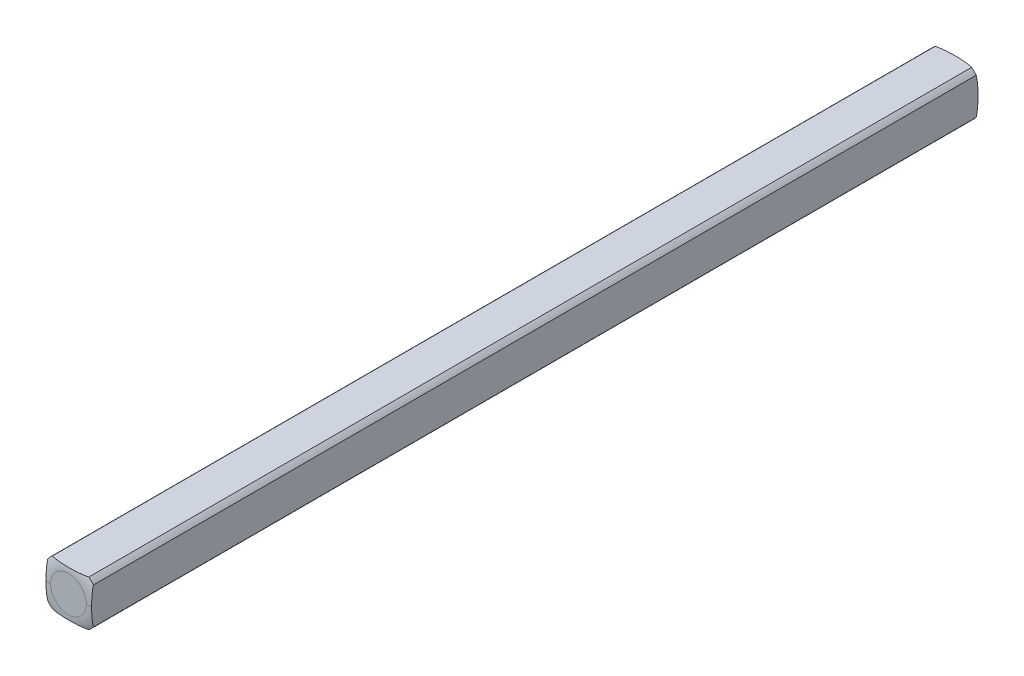
ISO-10303-21;
HEADER;
FILE_DESCRIPTION(('STEP AP214'),'2;1');
FILE_NAME('part.step','',(''),(''),'','','');
FILE_SCHEMA(('AUTOMOTIVE_DESIGN { 1 0 10303 214 1 1 1 1 }'));
ENDSEC;
DATA;
#1=APPLICATION_CONTEXT('core data for automotive mechanical design processes');
#2=APPLICATION_PROTOCOL_DEFINITION('international standard','automotive_design',2000,#1);
#3=PRODUCT_CONTEXT('',#1,'mechanical');
#4=PRODUCT('Part','Part','',(#3));
#5=PRODUCT_RELATED_PRODUCT_CATEGORY('part','',(#4));
#6=PRODUCT_DEFINITION_FORMATION('','',#4);
#7=PRODUCT_DEFINITION_CONTEXT('part definition',#1,'design');
#8=PRODUCT_DEFINITION('design','',#6,#7);
#9=PRODUCT_DEFINITION_SHAPE('','',#8);
#10=(LENGTH_UNIT() NAMED_UNIT(*) SI_UNIT(.MILLI.,.METRE.));
#11=(NAMED_UNIT(*) PLANE_ANGLE_UNIT() SI_UNIT($,.RADIAN.));
#12=(NAMED_UNIT(*) SI_UNIT($,.STERADIAN.) SOLID_ANGLE_UNIT());
#13=UNCERTAINTY_MEASURE_WITH_UNIT(LENGTH_MEASURE(1.E-05),#10,'distance_accuracy_value','');
#14=(GEOMETRIC_REPRESENTATION_CONTEXT(3) GLOBAL_UNCERTAINTY_ASSIGNED_CONTEXT((#13)) GLOBAL_UNIT_ASSIGNED_CONTEXT((#10,
#11,#12)) REPRESENTATION_CONTEXT('',''));
#15=CARTESIAN_POINT('',(0.,0.,0.));
#16=DIRECTION('',(0.,0.,1.));
#17=DIRECTION('',(1.,0.,0.));
#18=AXIS2_PLACEMENT_3D('',#15,#16,#17);
#19=CARTESIAN_POINT('',(0.,0.,-30.861));
#20=DIRECTION('',(0.,0.,1.));
#21=DIRECTION('',(1.,0.,0.));
#22=AXIS2_PLACEMENT_3D('',#19,#20,#21);
#23=CYLINDRICAL_SURFACE('',#22,2.032);
#24=CARTESIAN_POINT('',(0.,0.,-30.709919142098));
#25=DIRECTION('',(0.,0.,1.));
#26=DIRECTION('',(1.,0.,0.));
#27=AXIS2_PLACEMENT_3D('',#24,#25,#26);
#28=CIRCLE('',#27,2.032);
#29=CARTESIAN_POINT('',(-1.26841150657032,1.5875,-30.709919142098));
#30=VERTEX_POINT('',#29);
#31=CARTESIAN_POINT('',(-1.5875,1.26841150657032,-30.709919142098));
#32=VERTEX_POINT('',#31);
#33=EDGE_CURVE('E342',#30,#32,#28,.T.);
#34=ORIENTED_EDGE('',*,*,#33,.T.);
#35=DIRECTION('',(0.,0.,1.));
#36=VECTOR('',#35,1.);
#37=CARTESIAN_POINT('',(-1.5875,1.26841150657032,-30.861));
#38=LINE('',#37,#36);
#39=CARTESIAN_POINT('',(-1.5875,1.26841150657032,30.709919142098));
#40=VERTEX_POINT('',#39);
#41=EDGE_CURVE('E149',#32,#40,#38,.T.);
#42=ORIENTED_EDGE('',*,*,#41,.T.);
#43=CARTESIAN_POINT('',(0.,0.,30.709919142098));
#44=DIRECTION('',(0.,0.,-1.));
#45=DIRECTION('',(-1.,0.,0.));
#46=AXIS2_PLACEMENT_3D('',#43,#44,#45);
#47=CIRCLE('',#46,2.032);
#48=CARTESIAN_POINT('',(-1.26841150657032,1.5875,30.709919142098));
#49=VERTEX_POINT('',#48);
#50=EDGE_CURVE('E9',#40,#49,#47,.T.);
#51=ORIENTED_EDGE('',*,*,#50,.T.);
#52=DIRECTION('',(0.,0.,-1.));
#53=VECTOR('',#52,1.);
#54=CARTESIAN_POINT('',(-1.26841150657032,1.5875,-30.861));
#55=LINE('',#54,#53);
#56=EDGE_CURVE('E464',#49,#30,#55,.T.);
#57=ORIENTED_EDGE('',*,*,#56,.T.);
#58=EDGE_LOOP('',(#34,#42,#51,#57));
#59=FACE_BOUND('',#58,.T.);
#60=ADVANCED_FACE('F15',(#59),#23,.T.);
#61=CARTESIAN_POINT('',(0.,0.,-30.861));
#62=DIRECTION('',(0.,0.,1.));
#63=DIRECTION('',(1.,0.,0.));
#64=AXIS2_PLACEMENT_3D('',#61,#62,#63);
#65=CYLINDRICAL_SURFACE('',#64,2.032);
#66=CARTESIAN_POINT('',(0.,0.,-30.709919142098));
#67=DIRECTION('',(0.,0.,1.));
#68=DIRECTION('',(1.,0.,0.));
#69=AXIS2_PLACEMENT_3D('',#66,#67,#68);
#70=CIRCLE('',#69,2.032);
#71=CARTESIAN_POINT('',(1.5875,1.26841150657032,-30.709919142098));
#72=VERTEX_POINT('',#71);
#73=CARTESIAN_POINT('',(1.26841150657032,1.5875,-30.709919142098));
#74=VERTEX_POINT('',#73);
#75=EDGE_CURVE('E387',#72,#74,#70,.T.);
#76=ORIENTED_EDGE('',*,*,#75,.T.);
#77=DIRECTION('',(0.,0.,1.));
#78=VECTOR('',#77,1.);
#79=CARTESIAN_POINT('',(1.26841150657032,1.5875,-30.861));
#80=LINE('',#79,#78);
#81=CARTESIAN_POINT('',(1.26841150657032,1.5875,30.709919142098));
#82=VERTEX_POINT('',#81);
#83=EDGE_CURVE('E468',#74,#82,#80,.T.);
#84=ORIENTED_EDGE('',*,*,#83,.T.);
#85=CARTESIAN_POINT('',(0.,0.,30.709919142098));
#86=DIRECTION('',(0.,0.,-1.));
#87=DIRECTION('',(-1.,0.,0.));
#88=AXIS2_PLACEMENT_3D('',#85,#86,#87);
#89=CIRCLE('',#88,2.032);
#90=CARTESIAN_POINT('',(1.5875,1.26841150657032,30.709919142098));
#91=VERTEX_POINT('',#90);
#92=EDGE_CURVE('E30',#82,#91,#89,.T.);
#93=ORIENTED_EDGE('',*,*,#92,.T.);
#94=DIRECTION('',(0.,0.,-1.));
#95=VECTOR('',#94,1.);
#96=CARTESIAN_POINT('',(1.5875,1.26841150657032,-30.861));
#97=LINE('',#96,#95);
#98=EDGE_CURVE('E124',#91,#72,#97,.T.);
#99=ORIENTED_EDGE('',*,*,#98,.T.);
#100=EDGE_LOOP('',(#76,#84,#93,#99));
#101=FACE_BOUND('',#100,.T.);
#102=ADVANCED_FACE('F213',(#101),#65,.T.);
#103=CARTESIAN_POINT('',(0.,0.,-30.861));
#104=DIRECTION('',(0.,0.,1.));
#105=DIRECTION('',(1.,0.,0.));
#106=AXIS2_PLACEMENT_3D('',#103,#104,#105);
#107=CYLINDRICAL_SURFACE('',#106,2.032);
#108=CARTESIAN_POINT('',(0.,0.,-30.709919142098));
#109=DIRECTION('',(0.,0.,1.));
#110=DIRECTION('',(1.,0.,0.));
#111=AXIS2_PLACEMENT_3D('',#108,#109,#110);
#112=CIRCLE('',#111,2.032);
#113=CARTESIAN_POINT('',(1.26841150657032,-1.5875,-30.709919142098));
#114=VERTEX_POINT('',#113);
#115=CARTESIAN_POINT('',(1.5875,-1.26841150657032,-30.709919142098));
#116=VERTEX_POINT('',#115);
#117=EDGE_CURVE('E95',#114,#116,#112,.T.);
#118=ORIENTED_EDGE('',*,*,#117,.T.);
#119=DIRECTION('',(0.,0.,1.));
#120=VECTOR('',#119,1.);
#121=CARTESIAN_POINT('',(1.5875,-1.26841150657032,-30.861));
#122=LINE('',#121,#120);
#123=CARTESIAN_POINT('',(1.5875,-1.26841150657032,30.709919142098));
#124=VERTEX_POINT('',#123);
#125=EDGE_CURVE('E99',#116,#124,#122,.T.);
#126=ORIENTED_EDGE('',*,*,#125,.T.);
#127=CARTESIAN_POINT('',(0.,0.,30.709919142098));
#128=DIRECTION('',(0.,0.,-1.));
#129=DIRECTION('',(-1.,0.,0.));
#130=AXIS2_PLACEMENT_3D('',#127,#128,#129);
#131=CIRCLE('',#130,2.032);
#132=CARTESIAN_POINT('',(1.26841150657032,-1.5875,30.709919142098));
#133=VERTEX_POINT('',#132);
#134=EDGE_CURVE('E221',#124,#133,#131,.T.);
#135=ORIENTED_EDGE('',*,*,#134,.T.);
#136=DIRECTION('',(0.,0.,-1.));
#137=VECTOR('',#136,1.);
#138=CARTESIAN_POINT('',(1.26841150657032,-1.5875,-30.861));
#139=LINE('',#138,#137);
#140=EDGE_CURVE('E105',#133,#114,#139,.T.);
#141=ORIENTED_EDGE('',*,*,#140,.T.);
#142=EDGE_LOOP('',(#118,#126,#135,#141));
#143=FACE_BOUND('',#142,.T.);
#144=ADVANCED_FACE('F17',(#143),#107,.T.);
#145=CARTESIAN_POINT('',(0.,0.,-30.861));
#146=DIRECTION('',(0.,0.,1.));
#147=DIRECTION('',(1.,0.,0.));
#148=AXIS2_PLACEMENT_3D('',#145,#146,#147);
#149=CYLINDRICAL_SURFACE('',#148,2.032);
#150=CARTESIAN_POINT('',(0.,0.,-30.709919142098));
#151=DIRECTION('',(0.,0.,1.));
#152=DIRECTION('',(1.,0.,0.));
#153=AXIS2_PLACEMENT_3D('',#150,#151,#152);
#154=CIRCLE('',#153,2.032);
#155=CARTESIAN_POINT('',(-1.5875,-1.26841150657032,-30.709919142098));
#156=VERTEX_POINT('',#155);
#157=CARTESIAN_POINT('',(-1.26841150657032,-1.5875,-30.709919142098));
#158=VERTEX_POINT('',#157);
#159=EDGE_CURVE('E110',#156,#158,#154,.T.);
#160=ORIENTED_EDGE('',*,*,#159,.T.);
#161=DIRECTION('',(0.,0.,1.));
#162=VECTOR('',#161,1.);
#163=CARTESIAN_POINT('',(-1.26841150657032,-1.5875,-30.861));
#164=LINE('',#163,#162);
#165=CARTESIAN_POINT('',(-1.26841150657032,-1.5875,30.709919142098));
#166=VERTEX_POINT('',#165);
#167=EDGE_CURVE('E453',#158,#166,#164,.T.);
#168=ORIENTED_EDGE('',*,*,#167,.T.);
#169=CARTESIAN_POINT('',(0.,0.,30.709919142098));
#170=DIRECTION('',(0.,0.,-1.));
#171=DIRECTION('',(-1.,0.,0.));
#172=AXIS2_PLACEMENT_3D('',#169,#170,#171);
#173=CIRCLE('',#172,2.032);
#174=CARTESIAN_POINT('',(-1.5875,-1.26841150657032,30.709919142098));
#175=VERTEX_POINT('',#174);
#176=EDGE_CURVE('E200',#166,#175,#173,.T.);
#177=ORIENTED_EDGE('',*,*,#176,.T.);
#178=DIRECTION('',(0.,0.,-1.));
#179=VECTOR('',#178,1.);
#180=CARTESIAN_POINT('',(-1.5875,-1.26841150657032,-30.861));
#181=LINE('',#180,#179);
#182=EDGE_CURVE('E365',#175,#156,#181,.T.);
#183=ORIENTED_EDGE('',*,*,#182,.T.);
#184=EDGE_LOOP('',(#160,#168,#177,#183));
#185=FACE_BOUND('',#184,.T.);
#186=ADVANCED_FACE('F565',(#185),#149,.T.);
#187=CARTESIAN_POINT('',(-1.5875,1.5875,30.861));
#188=DIRECTION('',(0.,0.,-1.));
#189=DIRECTION('',(0.,-1.,0.));
#190=AXIS2_PLACEMENT_3D('',#187,#188,#189);
#191=PLANE('',#190);
#192=CARTESIAN_POINT('',(0.,0.,30.861));
#193=DIRECTION('',(0.,0.,1.));
#194=DIRECTION('',(1.,0.,0.));
#195=AXIS2_PLACEMENT_3D('',#192,#193,#194);
#196=CIRCLE('',#195,1.24506403026729);
#197=CARTESIAN_POINT('',(1.24506403026729,0.,30.861));
#198=VERTEX_POINT('',#197);
#199=CARTESIAN_POINT('',(-1.24506403026729,0.,30.861));
#200=VERTEX_POINT('',#199);
#201=EDGE_CURVE('E502',#198,#200,#196,.T.);
#202=ORIENTED_EDGE('',*,*,#201,.T.);
#203=CARTESIAN_POINT('',(0.,0.,30.861));
#204=DIRECTION('',(0.,0.,1.));
#205=DIRECTION('',(1.,0.,0.));
#206=AXIS2_PLACEMENT_3D('',#203,#204,#205);
#207=CIRCLE('',#206,1.24506403026729);
#208=EDGE_CURVE('E262',#200,#198,#207,.T.);
#209=ORIENTED_EDGE('',*,*,#208,.T.);
#210=EDGE_LOOP('',(#202,#209));
#211=FACE_BOUND('',#210,.T.);
#212=ADVANCED_FACE('F169',(#211),#191,.F.);
#213=CARTESIAN_POINT('',(-1.5875,1.5875,-30.861));
#214=DIRECTION('',(0.,0.,-1.));
#215=DIRECTION('',(0.,-1.,0.));
#216=AXIS2_PLACEMENT_3D('',#213,#214,#215);
#217=PLANE('',#216);
#218=CARTESIAN_POINT('',(0.,0.,-30.861));
#219=DIRECTION('',(0.,0.,1.));
#220=DIRECTION('',(1.,0.,0.));
#221=AXIS2_PLACEMENT_3D('',#218,#219,#220);
#222=CIRCLE('',#221,1.24506403026729);
#223=CARTESIAN_POINT('',(1.24506403026729,0.,-30.861));
#224=VERTEX_POINT('',#223);
#225=CARTESIAN_POINT('',(-1.24506403026729,0.,-30.861));
#226=VERTEX_POINT('',#225);
#227=EDGE_CURVE('E353',#224,#226,#222,.T.);
#228=ORIENTED_EDGE('',*,*,#227,.F.);
#229=CARTESIAN_POINT('',(0.,0.,-30.861));
#230=DIRECTION('',(0.,0.,1.));
#231=DIRECTION('',(1.,0.,0.));
#232=AXIS2_PLACEMENT_3D('',#229,#230,#231);
#233=CIRCLE('',#232,1.24506403026729);
#234=EDGE_CURVE('E108',#226,#224,#233,.T.);
#235=ORIENTED_EDGE('',*,*,#234,.F.);
#236=EDGE_LOOP('',(#228,#235));
#237=FACE_BOUND('',#236,.T.);
#238=ADVANCED_FACE('F536',(#237),#217,.T.);
#239=CARTESIAN_POINT('',(0.,0.,28.736));
#240=DIRECTION('',(0.,0.,-1.));
#241=DIRECTION('',(1.,0.,0.));
#242=AXIS2_PLACEMENT_3D('',#239,#240,#241);
#243=DEGENERATE_TOROIDAL_SURFACE('',#242,1.24506403026729,2.125,.T.);
#244=CARTESIAN_POINT('',(-1.24506403026729,0.,28.736));
#245=DIRECTION('',(0.,-1.,0.));
#246=DIRECTION('',(1.,0.,0.));
#247=AXIS2_PLACEMENT_3D('',#244,#245,#246);
#248=CIRCLE('',#247,2.125);
#249=CARTESIAN_POINT('',(-1.5875,0.,30.8332273616928));
#250=VERTEX_POINT('',#249);
#251=EDGE_CURVE('E251',#200,#250,#248,.T.);
#252=ORIENTED_EDGE('',*,*,#251,.F.);
#253=ORIENTED_EDGE('',*,*,#201,.F.);
#254=CARTESIAN_POINT('',(1.24506403026729,0.,28.736));
#255=DIRECTION('',(0.,1.,0.));
#256=DIRECTION('',(0.,0.,1.));
#257=AXIS2_PLACEMENT_3D('',#254,#255,#256);
#258=CIRCLE('',#257,2.125);
#259=CARTESIAN_POINT('',(1.5875,0.,30.8332273616928));
#260=VERTEX_POINT('',#259);
#261=EDGE_CURVE('E233',#198,#260,#258,.T.);
#262=ORIENTED_EDGE('',*,*,#261,.T.);
#263=CARTESIAN_POINT('',(1.5875,1.26841150657033,30.709919142098));
#264=CARTESIAN_POINT('',(1.5875,0.98707709494191,30.7799306391276));
#265=CARTESIAN_POINT('',(1.5875,0.63953045901757,30.8091819538896));
#266=CARTESIAN_POINT('',(1.5875,0.353837297550465,30.8332273616929));
#267=CARTESIAN_POINT('',(1.5875,0.,30.8332273616929));
#268=B_SPLINE_CURVE_WITH_KNOTS('',2,(#263,#264,#265,#266,#267),.UNSPECIFIED.,.F.,.F.,(3,2,3),
(0.,0.5,1.),.UNSPECIFIED.);
#269=EDGE_CURVE('E481',#91,#260,#268,.T.);
#270=ORIENTED_EDGE('',*,*,#269,.F.);
#271=ORIENTED_EDGE('',*,*,#92,.F.);
#272=CARTESIAN_POINT('',(-1.26841150657032,1.5875,30.709919142098));
#273=CARTESIAN_POINT('',(-0.770338232169053,1.5875,30.83386720579));
#274=CARTESIAN_POINT('',(0.00849337593368006,1.5875,30.8332236517902));
#275=CARTESIAN_POINT('',(0.775470990439385,1.5875,30.8325898928282));
#276=CARTESIAN_POINT('',(1.26841150657033,1.5875,30.709919142098));
#277=B_SPLINE_CURVE_WITH_KNOTS('',2,(#272,#273,#274,#275,#276),.UNSPECIFIED.,.F.,.F.,(3,2,3),
(0.,0.5,1.),.UNSPECIFIED.);
#278=EDGE_CURVE('E470',#49,#82,#277,.T.);
#279=ORIENTED_EDGE('',*,*,#278,.F.);
#280=ORIENTED_EDGE('',*,*,#50,.F.);
#281=CARTESIAN_POINT('',(-1.5875,0.,30.8332273616929));
#282=CARTESIAN_POINT('',(-1.5875,0.353179957359525,30.8332273616929));
#283=CARTESIAN_POINT('',(-1.5875,0.6395293222865,30.8091820494506));
#284=CARTESIAN_POINT('',(-1.5875,0.986669843218945,30.7800319857866));
#285=CARTESIAN_POINT('',(-1.5875,1.26841150657033,30.709919142098));
#286=B_SPLINE_CURVE_WITH_KNOTS('',2,(#281,#282,#283,#284,#285),.UNSPECIFIED.,.F.,.F.,(3,2,3),
(0.,0.5,1.),.UNSPECIFIED.);
#287=EDGE_CURVE('E369',#250,#40,#286,.T.);
#288=ORIENTED_EDGE('',*,*,#287,.F.);
#289=EDGE_LOOP('',(#252,#253,#262,#270,#271,#279,#280,#288));
#290=FACE_BOUND('',#289,.T.);
#291=ADVANCED_FACE('F544',(#290),#243,.T.);
#292=CARTESIAN_POINT('',(0.,0.,-28.736));
#293=DIRECTION('',(0.,0.,1.));
#294=DIRECTION('',(1.,0.,0.));
#295=AXIS2_PLACEMENT_3D('',#292,#293,#294);
#296=DEGENERATE_TOROIDAL_SURFACE('',#295,1.24506403026729,2.125,.T.);
#297=CARTESIAN_POINT('',(-1.24506403026729,0.,-28.736));
#298=DIRECTION('',(0.,1.,0.));
#299=DIRECTION('',(-1.,0.,0.));
#300=AXIS2_PLACEMENT_3D('',#297,#298,#299);
#301=CIRCLE('',#300,2.125);
#302=CARTESIAN_POINT('',(-1.5875,0.,-30.8332273616928));
#303=VERTEX_POINT('',#302);
#304=EDGE_CURVE('E346',#226,#303,#301,.T.);
#305=ORIENTED_EDGE('',*,*,#304,.F.);
#306=ORIENTED_EDGE('',*,*,#234,.T.);
#307=CARTESIAN_POINT('',(1.24506403026729,0.,-28.736));
#308=DIRECTION('',(0.,-1.,0.));
#309=DIRECTION('',(0.,0.,-1.));
#310=AXIS2_PLACEMENT_3D('',#307,#308,#309);
#311=CIRCLE('',#310,2.125);
#312=CARTESIAN_POINT('',(1.5875,0.,-30.8332273616928));
#313=VERTEX_POINT('',#312);
#314=EDGE_CURVE('E120',#224,#313,#311,.T.);
#315=ORIENTED_EDGE('',*,*,#314,.T.);
#316=CARTESIAN_POINT('',(1.5875,-1.26841150657032,-30.709919142098));
#317=CARTESIAN_POINT('',(1.5875,-0.987077094941871,-30.7799306391276));
#318=CARTESIAN_POINT('',(1.5875,-0.639530459017571,-30.8091819538897));
#319=CARTESIAN_POINT('',(1.5875,-0.353837297550392,-30.8332273616929));
#320=CARTESIAN_POINT('',(1.5875,0.,-30.8332273616929));
#321=B_SPLINE_CURVE_WITH_KNOTS('',2,(#316,#317,#318,#319,#320),.UNSPECIFIED.,.F.,.F.,(3,2,3),
(0.,0.5,1.),.UNSPECIFIED.);
#322=EDGE_CURVE('E111',#116,#313,#321,.T.);
#323=ORIENTED_EDGE('',*,*,#322,.F.);
#324=ORIENTED_EDGE('',*,*,#117,.F.);
#325=CARTESIAN_POINT('',(-1.26841150657032,-1.5875,-30.709919142098));
#326=CARTESIAN_POINT('',(-0.77033823217963,-1.5875,-30.8338672057874));
#327=CARTESIAN_POINT('',(0.00849337593368006,-1.5875,-30.8332236517903));
#328=CARTESIAN_POINT('',(0.77547099042887,-1.5875,-30.8325898928308));
#329=CARTESIAN_POINT('',(1.26841150657033,-1.5875,-30.709919142098));
#330=B_SPLINE_CURVE_WITH_KNOTS('',2,(#325,#326,#327,#328,#329),.UNSPECIFIED.,.F.,.F.,(3,2,3),
(0.,0.5,1.),.UNSPECIFIED.);
#331=EDGE_CURVE('E139',#158,#114,#330,.T.);
#332=ORIENTED_EDGE('',*,*,#331,.F.);
#333=ORIENTED_EDGE('',*,*,#159,.F.);
#334=CARTESIAN_POINT('',(-1.5875,0.,-30.8332273616929));
#335=CARTESIAN_POINT('',(-1.5875,-0.353179957348486,-30.8332273616929));
#336=CARTESIAN_POINT('',(-1.5875,-0.639529322286499,-30.8091820494506));
#337=CARTESIAN_POINT('',(-1.5875,-0.98666984321213,-30.7800319857884));
#338=CARTESIAN_POINT('',(-1.5875,-1.26841150657032,-30.709919142098));
#339=B_SPLINE_CURVE_WITH_KNOTS('',2,(#334,#335,#336,#337,#338),.UNSPECIFIED.,.F.,.F.,(3,2,3),
(0.,0.5,1.),.UNSPECIFIED.);
#340=EDGE_CURVE('E285',#303,#156,#339,.T.);
#341=ORIENTED_EDGE('',*,*,#340,.F.);
#342=EDGE_LOOP('',(#305,#306,#315,#323,#324,#332,#333,#341));
#343=FACE_BOUND('',#342,.T.);
#344=ADVANCED_FACE('F113',(#343),#296,.T.);
#345=CARTESIAN_POINT('',(-1.5875,1.5875,30.861));
#346=DIRECTION('',(0.,-1.,0.));
#347=DIRECTION('',(0.,0.,-1.));
#348=AXIS2_PLACEMENT_3D('',#345,#346,#347);
#349=PLANE('',#348);
#350=ORIENTED_EDGE('',*,*,#83,.F.);
#351=CARTESIAN_POINT('',(1.26841150657033,1.5875,-30.709919142098));
#352=CARTESIAN_POINT('',(0.77033823217963,1.5875,-30.8338672057874));
#353=CARTESIAN_POINT('',(-0.00849337593367984,1.5875,-30.8332236517903));
#354=CARTESIAN_POINT('',(-0.77547099042887,1.5875,-30.8325898928308));
#355=CARTESIAN_POINT('',(-1.26841150657032,1.5875,-30.709919142098));
#356=B_SPLINE_CURVE_WITH_KNOTS('',2,(#351,#352,#353,#354,#355),.UNSPECIFIED.,.F.,.F.,(3,2,3),
(0.,0.5,1.),.UNSPECIFIED.);
#357=EDGE_CURVE('E351',#74,#30,#356,.T.);
#358=ORIENTED_EDGE('',*,*,#357,.T.);
#359=ORIENTED_EDGE('',*,*,#56,.F.);
#360=ORIENTED_EDGE('',*,*,#278,.T.);
#361=EDGE_LOOP('',(#350,#358,#359,#360));
#362=FACE_BOUND('',#361,.T.);
#363=ADVANCED_FACE('F175',(#362),#349,.F.);
#364=CARTESIAN_POINT('',(1.5875,-1.5875,30.861));
#365=DIRECTION('',(-1.,0.,0.));
#366=DIRECTION('',(0.,0.,1.));
#367=AXIS2_PLACEMENT_3D('',#364,#365,#366);
#368=PLANE('',#367);
#369=ORIENTED_EDGE('',*,*,#125,.F.);
#370=ORIENTED_EDGE('',*,*,#322,.T.);
#371=CARTESIAN_POINT('',(1.5875,0.,-30.8332273616929));
#372=CARTESIAN_POINT('',(1.5875,0.35317995737037,-30.8332273616929));
#373=CARTESIAN_POINT('',(1.5875,0.6395293222865,-30.8091820494506));
#374=CARTESIAN_POINT('',(1.5875,0.98666984322564,-30.780031985785));
#375=CARTESIAN_POINT('',(1.5875,1.26841150657033,-30.709919142098));
#376=B_SPLINE_CURVE_WITH_KNOTS('',2,(#371,#372,#373,#374,#375),.UNSPECIFIED.,.F.,.F.,(3,2,3),
(0.,0.5,1.),.UNSPECIFIED.);
#377=EDGE_CURVE('E150',#313,#72,#376,.T.);
#378=ORIENTED_EDGE('',*,*,#377,.T.);
#379=ORIENTED_EDGE('',*,*,#98,.F.);
#380=ORIENTED_EDGE('',*,*,#269,.T.);
#381=CARTESIAN_POINT('',(1.5875,0.,30.8332273616929));
#382=CARTESIAN_POINT('',(1.5875,-0.353179957348652,30.8332273616929));
#383=CARTESIAN_POINT('',(1.5875,-0.639529322286499,30.8091820494506));
#384=CARTESIAN_POINT('',(1.5875,-0.98666984321203,30.7800319857883));
#385=CARTESIAN_POINT('',(1.5875,-1.26841150657032,30.709919142098));
#386=B_SPLINE_CURVE_WITH_KNOTS('',2,(#381,#382,#383,#384,#385),.UNSPECIFIED.,.F.,.F.,(3,2,3),
(0.,0.5,1.),.UNSPECIFIED.);
#387=EDGE_CURVE('E126',#260,#124,#386,.T.);
#388=ORIENTED_EDGE('',*,*,#387,.T.);
#389=EDGE_LOOP('',(#369,#370,#378,#379,#380,#388));
#390=FACE_BOUND('',#389,.T.);
#391=ADVANCED_FACE('F127',(#390),#368,.F.);
#392=CARTESIAN_POINT('',(-1.5875,-1.5875,30.861));
#393=DIRECTION('',(0.,1.,0.));
#394=DIRECTION('',(1.,0.,0.));
#395=AXIS2_PLACEMENT_3D('',#392,#393,#394);
#396=PLANE('',#395);
#397=ORIENTED_EDGE('',*,*,#167,.F.);
#398=ORIENTED_EDGE('',*,*,#331,.T.);
#399=ORIENTED_EDGE('',*,*,#140,.F.);
#400=CARTESIAN_POINT('',(1.26841150657033,-1.5875,30.709919142098));
#401=CARTESIAN_POINT('',(0.770338232169055,-1.5875,30.83386720579));
#402=CARTESIAN_POINT('',(-0.00849337593367984,-1.5875,30.8332236517902));
#403=CARTESIAN_POINT('',(-0.775470990439383,-1.5875,30.8325898928282));
#404=CARTESIAN_POINT('',(-1.26841150657032,-1.5875,30.709919142098));
#405=B_SPLINE_CURVE_WITH_KNOTS('',2,(#400,#401,#402,#403,#404),.UNSPECIFIED.,.F.,.F.,(3,2,3),
(0.,0.5,1.),.UNSPECIFIED.);
#406=EDGE_CURVE('E193',#133,#166,#405,.T.);
#407=ORIENTED_EDGE('',*,*,#406,.T.);
#408=EDGE_LOOP('',(#397,#398,#399,#407));
#409=FACE_BOUND('',#408,.T.);
#410=ADVANCED_FACE('F159',(#409),#396,.F.);
#411=CARTESIAN_POINT('',(-1.5875,-1.5875,30.861));
#412=DIRECTION('',(1.,0.,0.));
#413=DIRECTION('',(0.,1.,0.));
#414=AXIS2_PLACEMENT_3D('',#411,#412,#413);
#415=PLANE('',#414);
#416=ORIENTED_EDGE('',*,*,#41,.F.);
#417=CARTESIAN_POINT('',(-1.5875,1.26841150657033,-30.709919142098));
#418=CARTESIAN_POINT('',(-1.5875,0.98707709494189,-30.7799306391276));
#419=CARTESIAN_POINT('',(-1.5875,0.63953045901757,-30.8091819538897));
#420=CARTESIAN_POINT('',(-1.5875,0.35383729755042,-30.8332273616929));
#421=CARTESIAN_POINT('',(-1.5875,0.,-30.8332273616929));
#422=B_SPLINE_CURVE_WITH_KNOTS('',2,(#417,#418,#419,#420,#421),.UNSPECIFIED.,.F.,.F.,(3,2,3),
(0.,0.5,1.),.UNSPECIFIED.);
#423=EDGE_CURVE('E327',#32,#303,#422,.T.);
#424=ORIENTED_EDGE('',*,*,#423,.T.);
#425=ORIENTED_EDGE('',*,*,#340,.T.);
#426=ORIENTED_EDGE('',*,*,#182,.F.);
#427=CARTESIAN_POINT('',(-1.5875,-1.26841150657032,30.709919142098));
#428=CARTESIAN_POINT('',(-1.5875,-0.987077094941892,30.7799306391276));
#429=CARTESIAN_POINT('',(-1.5875,-0.639530459017571,30.8091819538896));
#430=CARTESIAN_POINT('',(-1.5875,-0.353837297550434,30.8332273616929));
#431=CARTESIAN_POINT('',(-1.5875,0.,30.8332273616929));
#432=B_SPLINE_CURVE_WITH_KNOTS('',2,(#427,#428,#429,#430,#431),.UNSPECIFIED.,.F.,.F.,(3,2,3),
(0.,0.5,1.),.UNSPECIFIED.);
#433=EDGE_CURVE('E242',#175,#250,#432,.T.);
#434=ORIENTED_EDGE('',*,*,#433,.T.);
#435=ORIENTED_EDGE('',*,*,#287,.T.);
#436=EDGE_LOOP('',(#416,#424,#425,#426,#434,#435));
#437=FACE_BOUND('',#436,.T.);
#438=ADVANCED_FACE('F167',(#437),#415,.F.);
#439=CARTESIAN_POINT('',(0.,0.,-28.736));
#440=DIRECTION('',(0.,0.,1.));
#441=DIRECTION('',(1.,0.,0.));
#442=AXIS2_PLACEMENT_3D('',#439,#440,#441);
#443=DEGENERATE_TOROIDAL_SURFACE('',#442,1.24506403026729,2.125,.T.);
#444=ORIENTED_EDGE('',*,*,#227,.T.);
#445=ORIENTED_EDGE('',*,*,#304,.T.);
#446=ORIENTED_EDGE('',*,*,#423,.F.);
#447=ORIENTED_EDGE('',*,*,#33,.F.);
#448=ORIENTED_EDGE('',*,*,#357,.F.);
#449=ORIENTED_EDGE('',*,*,#75,.F.);
#450=ORIENTED_EDGE('',*,*,#377,.F.);
#451=ORIENTED_EDGE('',*,*,#314,.F.);
#452=EDGE_LOOP('',(#444,#445,#446,#447,#448,#449,#450,#451));
#453=FACE_BOUND('',#452,.T.);
#454=ADVANCED_FACE('F206',(#453),#443,.T.);
#455=CARTESIAN_POINT('',(0.,0.,28.736));
#456=DIRECTION('',(0.,0.,-1.));
#457=DIRECTION('',(1.,0.,0.));
#458=AXIS2_PLACEMENT_3D('',#455,#456,#457);
#459=DEGENERATE_TOROIDAL_SURFACE('',#458,1.24506403026729,2.125,.T.);
#460=ORIENTED_EDGE('',*,*,#208,.F.);
#461=ORIENTED_EDGE('',*,*,#251,.T.);
#462=ORIENTED_EDGE('',*,*,#433,.F.);
#463=ORIENTED_EDGE('',*,*,#176,.F.);
#464=ORIENTED_EDGE('',*,*,#406,.F.);
#465=ORIENTED_EDGE('',*,*,#134,.F.);
#466=ORIENTED_EDGE('',*,*,#387,.F.);
#467=ORIENTED_EDGE('',*,*,#261,.F.);
#468=EDGE_LOOP('',(#460,#461,#462,#463,#464,#465,#466,#467));
#469=FACE_BOUND('',#468,.T.);
#470=ADVANCED_FACE('F196',(#469),#459,.T.);
#471=CLOSED_SHELL('',(#60,#102,#144,#186,#212,#238,#291,#344,#363,#391,#410,#438,#454,#470));
#472=MANIFOLD_SOLID_BREP('B1',#471);
#473=ADVANCED_BREP_SHAPE_REPRESENTATION('',(#18,#472),#14);
#474=SHAPE_DEFINITION_REPRESENTATION(#9,#473);
ENDSEC;
END-ISO-10303-21;
